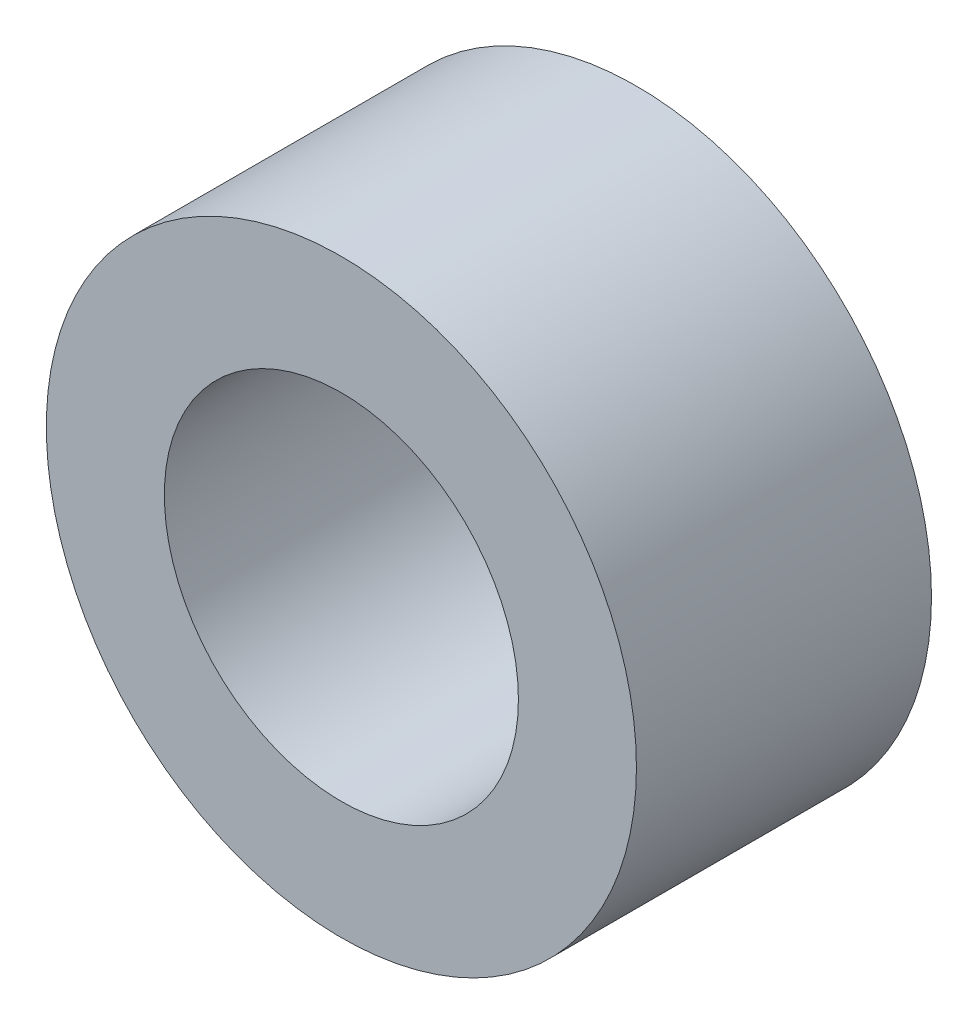
ISO-10303-21;
HEADER;
FILE_DESCRIPTION(('STEP AP214'),'2;1');
FILE_NAME('part.step','',(''),(''),'','','');
FILE_SCHEMA(('AUTOMOTIVE_DESIGN { 1 0 10303 214 1 1 1 1 }'));
ENDSEC;
DATA;
#1=APPLICATION_CONTEXT('core data for automotive mechanical design processes');
#2=APPLICATION_PROTOCOL_DEFINITION('international standard','automotive_design',2000,#1);
#3=PRODUCT_CONTEXT('',#1,'mechanical');
#4=PRODUCT('Part','Part','',(#3));
#5=PRODUCT_RELATED_PRODUCT_CATEGORY('part','',(#4));
#6=PRODUCT_DEFINITION_FORMATION('','',#4);
#7=PRODUCT_DEFINITION_CONTEXT('part definition',#1,'design');
#8=PRODUCT_DEFINITION('design','',#6,#7);
#9=PRODUCT_DEFINITION_SHAPE('','',#8);
#10=(LENGTH_UNIT() NAMED_UNIT(*) SI_UNIT(.MILLI.,.METRE.));
#11=(NAMED_UNIT(*) PLANE_ANGLE_UNIT() SI_UNIT($,.RADIAN.));
#12=(NAMED_UNIT(*) SI_UNIT($,.STERADIAN.) SOLID_ANGLE_UNIT());
#13=UNCERTAINTY_MEASURE_WITH_UNIT(LENGTH_MEASURE(1.E-05),#10,'distance_accuracy_value','');
#14=(GEOMETRIC_REPRESENTATION_CONTEXT(3) GLOBAL_UNCERTAINTY_ASSIGNED_CONTEXT((#13)) GLOBAL_UNIT_ASSIGNED_CONTEXT((#10,
#11,#12)) REPRESENTATION_CONTEXT('',''));
#15=CARTESIAN_POINT('',(0.,0.,0.));
#16=DIRECTION('',(0.,0.,1.));
#17=DIRECTION('',(1.,0.,0.));
#18=AXIS2_PLACEMENT_3D('',#15,#16,#17);
#19=CARTESIAN_POINT('',(0.,0.,2.5));
#20=DIRECTION('',(0.,0.,1.));
#21=DIRECTION('',(1.,0.,0.));
#22=AXIS2_PLACEMENT_3D('',#19,#20,#21);
#23=PLANE('',#22);
#24=CARTESIAN_POINT('',(0.,0.,2.5));
#25=DIRECTION('',(0.,0.,1.));
#26=DIRECTION('',(1.,0.,0.));
#27=AXIS2_PLACEMENT_3D('',#24,#25,#26);
#28=CIRCLE('',#27,2.5);
#29=CARTESIAN_POINT('',(2.5,0.,2.5));
#30=VERTEX_POINT('',#29);
#31=EDGE_CURVE('E10',#30,#30,#28,.T.);
#32=ORIENTED_EDGE('',*,*,#31,.T.);
#33=EDGE_LOOP('',(#32));
#34=FACE_BOUND('',#33,.T.);
#35=CARTESIAN_POINT('',(0.,0.,2.5));
#36=DIRECTION('',(0.,0.,1.));
#37=DIRECTION('',(1.,0.,0.));
#38=AXIS2_PLACEMENT_3D('',#35,#36,#37);
#39=CIRCLE('',#38,1.5);
#40=CARTESIAN_POINT('',(1.5,0.,2.5));
#41=VERTEX_POINT('',#40);
#42=EDGE_CURVE('E49',#41,#41,#39,.T.);
#43=ORIENTED_EDGE('',*,*,#42,.F.);
#44=EDGE_LOOP('',(#43));
#45=FACE_BOUND('',#44,.T.);
#46=ADVANCED_FACE('F39',(#34,#45),#23,.T.);
#47=CARTESIAN_POINT('',(0.,0.,0.));
#48=DIRECTION('',(0.,0.,1.));
#49=DIRECTION('',(1.,0.,0.));
#50=AXIS2_PLACEMENT_3D('',#47,#48,#49);
#51=PLANE('',#50);
#52=CARTESIAN_POINT('',(0.,0.,0.));
#53=DIRECTION('',(0.,0.,1.));
#54=DIRECTION('',(1.,0.,0.));
#55=AXIS2_PLACEMENT_3D('',#52,#53,#54);
#56=CIRCLE('',#55,2.5);
#57=CARTESIAN_POINT('',(2.5,0.,0.));
#58=VERTEX_POINT('',#57);
#59=EDGE_CURVE('E43',#58,#58,#56,.T.);
#60=ORIENTED_EDGE('',*,*,#59,.F.);
#61=EDGE_LOOP('',(#60));
#62=FACE_BOUND('',#61,.T.);
#63=CARTESIAN_POINT('',(0.,0.,0.));
#64=DIRECTION('',(0.,0.,1.));
#65=DIRECTION('',(1.,0.,0.));
#66=AXIS2_PLACEMENT_3D('',#63,#64,#65);
#67=CIRCLE('',#66,1.5);
#68=CARTESIAN_POINT('',(1.5,0.,0.));
#69=VERTEX_POINT('',#68);
#70=EDGE_CURVE('E55',#69,#69,#67,.T.);
#71=ORIENTED_EDGE('',*,*,#70,.T.);
#72=EDGE_LOOP('',(#71));
#73=FACE_BOUND('',#72,.T.);
#74=ADVANCED_FACE('F64',(#62,#73),#51,.F.);
#75=CARTESIAN_POINT('',(0.,0.,2.5));
#76=DIRECTION('',(0.,0.,-1.));
#77=DIRECTION('',(-1.,0.,0.));
#78=AXIS2_PLACEMENT_3D('',#75,#76,#77);
#79=CYLINDRICAL_SURFACE('',#78,2.5);
#80=ORIENTED_EDGE('',*,*,#31,.F.);
#81=EDGE_LOOP('',(#80));
#82=FACE_BOUND('',#81,.T.);
#83=ORIENTED_EDGE('',*,*,#59,.T.);
#84=EDGE_LOOP('',(#83));
#85=FACE_BOUND('',#84,.T.);
#86=ADVANCED_FACE('F41',(#82,#85),#79,.T.);
#87=CARTESIAN_POINT('',(0.,0.,2.5));
#88=DIRECTION('',(0.,0.,-1.));
#89=DIRECTION('',(-1.,0.,0.));
#90=AXIS2_PLACEMENT_3D('',#87,#88,#89);
#91=CYLINDRICAL_SURFACE('',#90,1.5);
#92=ORIENTED_EDGE('',*,*,#42,.T.);
#93=EDGE_LOOP('',(#92));
#94=FACE_BOUND('',#93,.T.);
#95=ORIENTED_EDGE('',*,*,#70,.F.);
#96=EDGE_LOOP('',(#95));
#97=FACE_BOUND('',#96,.T.);
#98=ADVANCED_FACE('F59',(#94,#97),#91,.F.);
#99=CLOSED_SHELL('',(#46,#74,#86,#98));
#100=MANIFOLD_SOLID_BREP('B2',#99);
#101=ADVANCED_BREP_SHAPE_REPRESENTATION('',(#18,#100),#14);
#102=SHAPE_DEFINITION_REPRESENTATION(#9,#101);
ENDSEC;
END-ISO-10303-21;
